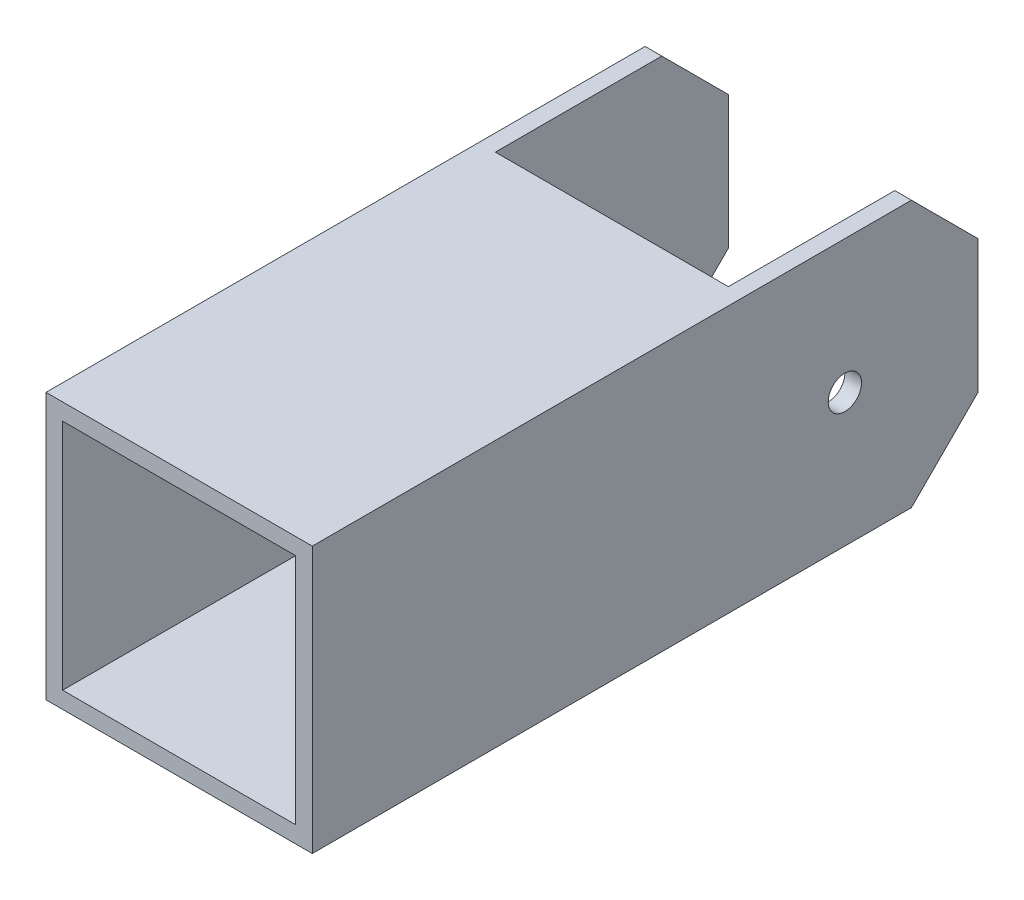
ISO-10303-21;
HEADER;
FILE_DESCRIPTION(('STEP AP214'),'2;1');
FILE_NAME('part.step','',(''),(''),'','','');
FILE_SCHEMA(('AUTOMOTIVE_DESIGN { 1 0 10303 214 1 1 1 1 }'));
ENDSEC;
DATA;
#1=APPLICATION_CONTEXT('core data for automotive mechanical design processes');
#2=APPLICATION_PROTOCOL_DEFINITION('international standard','automotive_design',2000,#1);
#3=PRODUCT_CONTEXT('',#1,'mechanical');
#4=PRODUCT('Part','Part','',(#3));
#5=PRODUCT_RELATED_PRODUCT_CATEGORY('part','',(#4));
#6=PRODUCT_DEFINITION_FORMATION('','',#4);
#7=PRODUCT_DEFINITION_CONTEXT('part definition',#1,'design');
#8=PRODUCT_DEFINITION('design','',#6,#7);
#9=PRODUCT_DEFINITION_SHAPE('','',#8);
#10=(LENGTH_UNIT() NAMED_UNIT(*) SI_UNIT(.MILLI.,.METRE.));
#11=(NAMED_UNIT(*) PLANE_ANGLE_UNIT() SI_UNIT($,.RADIAN.));
#12=(NAMED_UNIT(*) SI_UNIT($,.STERADIAN.) SOLID_ANGLE_UNIT());
#13=UNCERTAINTY_MEASURE_WITH_UNIT(LENGTH_MEASURE(1.E-05),#10,'distance_accuracy_value','');
#14=(GEOMETRIC_REPRESENTATION_CONTEXT(3) GLOBAL_UNCERTAINTY_ASSIGNED_CONTEXT((#13)) GLOBAL_UNIT_ASSIGNED_CONTEXT((#10,
#11,#12)) REPRESENTATION_CONTEXT('',''));
#15=CARTESIAN_POINT('',(0.,0.,0.));
#16=DIRECTION('',(0.,0.,1.));
#17=DIRECTION('',(1.,0.,0.));
#18=AXIS2_PLACEMENT_3D('',#15,#16,#17);
#19=CARTESIAN_POINT('',(0.,0.,0.));
#20=DIRECTION('',(0.,0.,1.));
#21=DIRECTION('',(1.,0.,0.));
#22=AXIS2_PLACEMENT_3D('',#19,#20,#21);
#23=PLANE('',#22);
#24=DIRECTION('',(0.,1.,0.));
#25=VECTOR('',#24,1.);
#26=CARTESIAN_POINT('',(22.225,22.225,0.));
#27=LINE('',#26,#25);
#28=CARTESIAN_POINT('',(22.225,-12.7,0.));
#29=VERTEX_POINT('',#28);
#30=CARTESIAN_POINT('',(22.225,12.7,0.));
#31=VERTEX_POINT('',#30);
#32=EDGE_CURVE('E197',#29,#31,#27,.T.);
#33=ORIENTED_EDGE('',*,*,#32,.T.);
#34=DIRECTION('',(1.,0.,0.));
#35=VECTOR('',#34,1.);
#36=CARTESIAN_POINT('',(0.,12.7,0.));
#37=LINE('',#36,#35);
#38=CARTESIAN_POINT('',(25.4,12.7,0.));
#39=VERTEX_POINT('',#38);
#40=EDGE_CURVE('E262',#31,#39,#37,.T.);
#41=ORIENTED_EDGE('',*,*,#40,.T.);
#42=DIRECTION('',(0.,1.,0.));
#43=VECTOR('',#42,1.);
#44=CARTESIAN_POINT('',(25.4,25.4,0.));
#45=LINE('',#44,#43);
#46=CARTESIAN_POINT('',(25.4,-12.7,0.));
#47=VERTEX_POINT('',#46);
#48=EDGE_CURVE('E220',#47,#39,#45,.T.);
#49=ORIENTED_EDGE('',*,*,#48,.F.);
#50=DIRECTION('',(-1.,0.,0.));
#51=VECTOR('',#50,1.);
#52=CARTESIAN_POINT('',(0.,-12.7,0.));
#53=LINE('',#52,#51);
#54=EDGE_CURVE('E260',#47,#29,#53,.T.);
#55=ORIENTED_EDGE('',*,*,#54,.T.);
#56=EDGE_LOOP('',(#33,#41,#49,#55));
#57=FACE_BOUND('',#56,.T.);
#58=ADVANCED_FACE('F35',(#57),#23,.F.);
#59=CARTESIAN_POINT('',(0.,0.,127.));
#60=DIRECTION('',(0.,0.,1.));
#61=DIRECTION('',(1.,0.,0.));
#62=AXIS2_PLACEMENT_3D('',#59,#60,#61);
#63=PLANE('',#62);
#64=DIRECTION('',(0.,1.,0.));
#65=VECTOR('',#64,1.);
#66=CARTESIAN_POINT('',(25.4,25.4,127.));
#67=LINE('',#66,#65);
#68=CARTESIAN_POINT('',(25.4,-25.4,127.));
#69=VERTEX_POINT('',#68);
#70=CARTESIAN_POINT('',(25.4,25.4,127.));
#71=VERTEX_POINT('',#70);
#72=EDGE_CURVE('E221',#69,#71,#67,.T.);
#73=ORIENTED_EDGE('',*,*,#72,.T.);
#74=DIRECTION('',(-1.,0.,0.));
#75=VECTOR('',#74,1.);
#76=CARTESIAN_POINT('',(-25.4,25.4,127.));
#77=LINE('',#76,#75);
#78=CARTESIAN_POINT('',(-25.4,25.4,127.));
#79=VERTEX_POINT('',#78);
#80=EDGE_CURVE('E224',#71,#79,#77,.T.);
#81=ORIENTED_EDGE('',*,*,#80,.T.);
#82=DIRECTION('',(0.,-1.,0.));
#83=VECTOR('',#82,1.);
#84=CARTESIAN_POINT('',(-25.4,25.4,127.));
#85=LINE('',#84,#83);
#86=CARTESIAN_POINT('',(-25.4,-25.4,127.));
#87=VERTEX_POINT('',#86);
#88=EDGE_CURVE('E227',#79,#87,#85,.T.);
#89=ORIENTED_EDGE('',*,*,#88,.T.);
#90=DIRECTION('',(1.,0.,0.));
#91=VECTOR('',#90,1.);
#92=CARTESIAN_POINT('',(-25.4,-25.4,127.));
#93=LINE('',#92,#91);
#94=EDGE_CURVE('E229',#87,#69,#93,.T.);
#95=ORIENTED_EDGE('',*,*,#94,.T.);
#96=EDGE_LOOP('',(#73,#81,#89,#95));
#97=FACE_BOUND('',#96,.T.);
#98=DIRECTION('',(-1.,0.,0.));
#99=VECTOR('',#98,1.);
#100=CARTESIAN_POINT('',(-22.225,22.225,127.));
#101=LINE('',#100,#99);
#102=CARTESIAN_POINT('',(22.225,22.225,127.));
#103=VERTEX_POINT('',#102);
#104=CARTESIAN_POINT('',(-22.225,22.225,127.));
#105=VERTEX_POINT('',#104);
#106=EDGE_CURVE('E200',#103,#105,#101,.T.);
#107=ORIENTED_EDGE('',*,*,#106,.F.);
#108=DIRECTION('',(0.,1.,0.));
#109=VECTOR('',#108,1.);
#110=CARTESIAN_POINT('',(22.225,22.225,127.));
#111=LINE('',#110,#109);
#112=CARTESIAN_POINT('',(22.225,-22.225,127.));
#113=VERTEX_POINT('',#112);
#114=EDGE_CURVE('E198',#113,#103,#111,.T.);
#115=ORIENTED_EDGE('',*,*,#114,.F.);
#116=DIRECTION('',(1.,0.,0.));
#117=VECTOR('',#116,1.);
#118=CARTESIAN_POINT('',(-22.225,-22.225,127.));
#119=LINE('',#118,#117);
#120=CARTESIAN_POINT('',(-22.225,-22.225,127.));
#121=VERTEX_POINT('',#120);
#122=EDGE_CURVE('E205',#121,#113,#119,.T.);
#123=ORIENTED_EDGE('',*,*,#122,.F.);
#124=DIRECTION('',(0.,-1.,0.));
#125=VECTOR('',#124,1.);
#126=CARTESIAN_POINT('',(-22.225,22.225,127.));
#127=LINE('',#126,#125);
#128=EDGE_CURVE('E203',#105,#121,#127,.T.);
#129=ORIENTED_EDGE('',*,*,#128,.F.);
#130=EDGE_LOOP('',(#107,#115,#123,#129));
#131=FACE_BOUND('',#130,.T.);
#132=ADVANCED_FACE('F290',(#97,#131),#63,.T.);
#133=DIRECTION('',(0.,-1.,0.));
#134=VECTOR('',#133,1.);
#135=CARTESIAN_POINT('',(-25.4,25.4,0.));
#136=LINE('',#135,#134);
#137=CARTESIAN_POINT('',(-25.4,12.7,0.));
#138=VERTEX_POINT('',#137);
#139=CARTESIAN_POINT('',(-25.4,-12.7,0.));
#140=VERTEX_POINT('',#139);
#141=EDGE_CURVE('E225',#138,#140,#136,.T.);
#142=ORIENTED_EDGE('',*,*,#141,.F.);
#143=DIRECTION('',(1.,0.,0.));
#144=VECTOR('',#143,1.);
#145=CARTESIAN_POINT('',(0.,12.7,0.));
#146=LINE('',#145,#144);
#147=CARTESIAN_POINT('',(-22.225,12.7,0.));
#148=VERTEX_POINT('',#147);
#149=EDGE_CURVE('E274',#138,#148,#146,.T.);
#150=ORIENTED_EDGE('',*,*,#149,.T.);
#151=DIRECTION('',(0.,-1.,0.));
#152=VECTOR('',#151,1.);
#153=CARTESIAN_POINT('',(-22.225,22.225,0.));
#154=LINE('',#153,#152);
#155=CARTESIAN_POINT('',(-22.225,-12.7,0.));
#156=VERTEX_POINT('',#155);
#157=EDGE_CURVE('E201',#148,#156,#154,.T.);
#158=ORIENTED_EDGE('',*,*,#157,.T.);
#159=DIRECTION('',(-1.,0.,0.));
#160=VECTOR('',#159,1.);
#161=CARTESIAN_POINT('',(0.,-12.7,0.));
#162=LINE('',#161,#160);
#163=EDGE_CURVE('E272',#156,#140,#162,.T.);
#164=ORIENTED_EDGE('',*,*,#163,.T.);
#165=EDGE_LOOP('',(#142,#150,#158,#164));
#166=FACE_BOUND('',#165,.T.);
#167=ADVANCED_FACE('F302',(#166),#23,.F.);
#168=CARTESIAN_POINT('',(25.4,25.4,127.));
#169=DIRECTION('',(-1.,0.,0.));
#170=DIRECTION('',(0.,-1.,0.));
#171=AXIS2_PLACEMENT_3D('',#168,#169,#170);
#172=PLANE('',#171);
#173=CARTESIAN_POINT('',(25.4,0.,25.4));
#174=DIRECTION('',(-1.,0.,0.));
#175=DIRECTION('',(0.,0.,1.));
#176=AXIS2_PLACEMENT_3D('',#173,#174,#175);
#177=CIRCLE('',#176,3.17499999999997);
#178=CARTESIAN_POINT('',(25.4,0.,28.5749999999999));
#179=VERTEX_POINT('',#178);
#180=EDGE_CURVE('E188',#179,#179,#177,.T.);
#181=ORIENTED_EDGE('',*,*,#180,.T.);
#182=EDGE_LOOP('',(#181));
#183=FACE_BOUND('',#182,.T.);
#184=ORIENTED_EDGE('',*,*,#48,.T.);
#185=DIRECTION('',(0.,-0.707106781186549,-0.707106781186546));
#186=VECTOR('',#185,1.);
#187=CARTESIAN_POINT('',(25.4,25.4,12.7));
#188=LINE('',#187,#186);
#189=CARTESIAN_POINT('',(25.4,25.4,12.7));
#190=VERTEX_POINT('',#189);
#191=EDGE_CURVE('E266',#39,#190,#188,.F.);
#192=ORIENTED_EDGE('',*,*,#191,.T.);
#193=DIRECTION('',(0.,0.,-1.));
#194=VECTOR('',#193,1.);
#195=CARTESIAN_POINT('',(25.4,25.4,127.));
#196=LINE('',#195,#194);
#197=EDGE_CURVE('E243',#71,#190,#196,.T.);
#198=ORIENTED_EDGE('',*,*,#197,.F.);
#199=ORIENTED_EDGE('',*,*,#72,.F.);
#200=DIRECTION('',(0.,0.,-1.));
#201=VECTOR('',#200,1.);
#202=CARTESIAN_POINT('',(25.4,-25.4,127.));
#203=LINE('',#202,#201);
#204=CARTESIAN_POINT('',(25.4,-25.4,12.7));
#205=VERTEX_POINT('',#204);
#206=EDGE_CURVE('E231',#69,#205,#203,.T.);
#207=ORIENTED_EDGE('',*,*,#206,.T.);
#208=DIRECTION('',(0.,-0.707106781186549,0.707106781186546));
#209=VECTOR('',#208,1.);
#210=CARTESIAN_POINT('',(25.4,-25.4,12.7));
#211=LINE('',#210,#209);
#212=EDGE_CURVE('E264',#205,#47,#211,.F.);
#213=ORIENTED_EDGE('',*,*,#212,.T.);
#214=EDGE_LOOP('',(#184,#192,#198,#199,#207,#213));
#215=FACE_BOUND('',#214,.T.);
#216=ADVANCED_FACE('F286',(#183,#215),#172,.F.);
#217=CARTESIAN_POINT('',(-25.4,25.4,127.));
#218=DIRECTION('',(0.,-1.,0.));
#219=DIRECTION('',(0.,0.,-1.));
#220=AXIS2_PLACEMENT_3D('',#217,#218,#219);
#221=PLANE('',#220);
#222=ORIENTED_EDGE('',*,*,#197,.T.);
#223=DIRECTION('',(-1.,0.,0.));
#224=VECTOR('',#223,1.);
#225=CARTESIAN_POINT('',(-25.4,25.4,12.7));
#226=LINE('',#225,#224);
#227=CARTESIAN_POINT('',(22.225,25.4,12.7));
#228=VERTEX_POINT('',#227);
#229=EDGE_CURVE('E253',#190,#228,#226,.T.);
#230=ORIENTED_EDGE('',*,*,#229,.T.);
#231=DIRECTION('',(0.,0.,-1.));
#232=VECTOR('',#231,1.);
#233=CARTESIAN_POINT('',(22.225,25.4,0.));
#234=LINE('',#233,#232);
#235=CARTESIAN_POINT('',(22.225,25.4,44.45));
#236=VERTEX_POINT('',#235);
#237=EDGE_CURVE('E175',#236,#228,#234,.T.);
#238=ORIENTED_EDGE('',*,*,#237,.F.);
#239=DIRECTION('',(1.,0.,0.));
#240=VECTOR('',#239,1.);
#241=CARTESIAN_POINT('',(22.225,25.4,44.45));
#242=LINE('',#241,#240);
#243=CARTESIAN_POINT('',(-22.225,25.4,44.45));
#244=VERTEX_POINT('',#243);
#245=EDGE_CURVE('E180',#244,#236,#242,.T.);
#246=ORIENTED_EDGE('',*,*,#245,.F.);
#247=DIRECTION('',(0.,0.,1.));
#248=VECTOR('',#247,1.);
#249=CARTESIAN_POINT('',(-22.225,25.4,0.));
#250=LINE('',#249,#248);
#251=CARTESIAN_POINT('',(-22.225,25.4,12.7));
#252=VERTEX_POINT('',#251);
#253=EDGE_CURVE('E178',#252,#244,#250,.T.);
#254=ORIENTED_EDGE('',*,*,#253,.F.);
#255=DIRECTION('',(-1.,0.,0.));
#256=VECTOR('',#255,1.);
#257=CARTESIAN_POINT('',(-25.4,25.4,12.7));
#258=LINE('',#257,#256);
#259=CARTESIAN_POINT('',(-25.4,25.4,12.7));
#260=VERTEX_POINT('',#259);
#261=EDGE_CURVE('E250',#252,#260,#258,.T.);
#262=ORIENTED_EDGE('',*,*,#261,.T.);
#263=DIRECTION('',(0.,0.,-1.));
#264=VECTOR('',#263,1.);
#265=CARTESIAN_POINT('',(-25.4,25.4,127.));
#266=LINE('',#265,#264);
#267=EDGE_CURVE('E240',#79,#260,#266,.T.);
#268=ORIENTED_EDGE('',*,*,#267,.F.);
#269=ORIENTED_EDGE('',*,*,#80,.F.);
#270=EDGE_LOOP('',(#222,#230,#238,#246,#254,#262,#268,#269));
#271=FACE_BOUND('',#270,.T.);
#272=ADVANCED_FACE('F310',(#271),#221,.F.);
#273=CARTESIAN_POINT('',(-25.4,25.4,127.));
#274=DIRECTION('',(1.,0.,0.));
#275=DIRECTION('',(0.,1.,0.));
#276=AXIS2_PLACEMENT_3D('',#273,#274,#275);
#277=PLANE('',#276);
#278=CARTESIAN_POINT('',(-25.4,0.,25.4));
#279=DIRECTION('',(-1.,0.,0.));
#280=DIRECTION('',(0.,0.,1.));
#281=AXIS2_PLACEMENT_3D('',#278,#279,#280);
#282=CIRCLE('',#281,3.17499999999997);
#283=CARTESIAN_POINT('',(-25.4,0.,28.5749999999999));
#284=VERTEX_POINT('',#283);
#285=EDGE_CURVE('E187',#284,#284,#282,.T.);
#286=ORIENTED_EDGE('',*,*,#285,.F.);
#287=EDGE_LOOP('',(#286));
#288=FACE_BOUND('',#287,.T.);
#289=ORIENTED_EDGE('',*,*,#267,.T.);
#290=DIRECTION('',(0.,0.707106781186549,0.707106781186546));
#291=VECTOR('',#290,1.);
#292=CARTESIAN_POINT('',(-25.4,25.4,12.7));
#293=LINE('',#292,#291);
#294=EDGE_CURVE('E270',#260,#138,#293,.F.);
#295=ORIENTED_EDGE('',*,*,#294,.T.);
#296=ORIENTED_EDGE('',*,*,#141,.T.);
#297=DIRECTION('',(0.,0.707106781186549,-0.707106781186546));
#298=VECTOR('',#297,1.);
#299=CARTESIAN_POINT('',(-25.4,-25.4,12.7));
#300=LINE('',#299,#298);
#301=CARTESIAN_POINT('',(-25.4,-25.4,12.7));
#302=VERTEX_POINT('',#301);
#303=EDGE_CURVE('E268',#140,#302,#300,.F.);
#304=ORIENTED_EDGE('',*,*,#303,.T.);
#305=DIRECTION('',(0.,0.,-1.));
#306=VECTOR('',#305,1.);
#307=CARTESIAN_POINT('',(-25.4,-25.4,127.));
#308=LINE('',#307,#306);
#309=EDGE_CURVE('E238',#87,#302,#308,.T.);
#310=ORIENTED_EDGE('',*,*,#309,.F.);
#311=ORIENTED_EDGE('',*,*,#88,.F.);
#312=EDGE_LOOP('',(#289,#295,#296,#304,#310,#311));
#313=FACE_BOUND('',#312,.T.);
#314=ADVANCED_FACE('F298',(#288,#313),#277,.F.);
#315=CARTESIAN_POINT('',(-25.4,-25.4,127.));
#316=DIRECTION('',(0.,1.,0.));
#317=DIRECTION('',(0.,0.,1.));
#318=AXIS2_PLACEMENT_3D('',#315,#316,#317);
#319=PLANE('',#318);
#320=ORIENTED_EDGE('',*,*,#309,.T.);
#321=DIRECTION('',(1.,0.,0.));
#322=VECTOR('',#321,1.);
#323=CARTESIAN_POINT('',(-25.4,-25.4,12.7));
#324=LINE('',#323,#322);
#325=CARTESIAN_POINT('',(-22.225,-25.4,12.7));
#326=VERTEX_POINT('',#325);
#327=EDGE_CURVE('E11',#302,#326,#324,.T.);
#328=ORIENTED_EDGE('',*,*,#327,.T.);
#329=DIRECTION('',(0.,0.,1.));
#330=VECTOR('',#329,1.);
#331=CARTESIAN_POINT('',(-22.225,-25.4,0.));
#332=LINE('',#331,#330);
#333=CARTESIAN_POINT('',(-22.225,-25.4,44.45));
#334=VERTEX_POINT('',#333);
#335=EDGE_CURVE('E147',#326,#334,#332,.T.);
#336=ORIENTED_EDGE('',*,*,#335,.T.);
#337=DIRECTION('',(1.,0.,0.));
#338=VECTOR('',#337,1.);
#339=CARTESIAN_POINT('',(22.225,-25.4,44.45));
#340=LINE('',#339,#338);
#341=CARTESIAN_POINT('',(22.225,-25.4,44.45));
#342=VERTEX_POINT('',#341);
#343=EDGE_CURVE('E153',#334,#342,#340,.T.);
#344=ORIENTED_EDGE('',*,*,#343,.T.);
#345=DIRECTION('',(0.,0.,-1.));
#346=VECTOR('',#345,1.);
#347=CARTESIAN_POINT('',(22.225,-25.4,0.));
#348=LINE('',#347,#346);
#349=CARTESIAN_POINT('',(22.225,-25.4,12.7));
#350=VERTEX_POINT('',#349);
#351=EDGE_CURVE('E154',#342,#350,#348,.T.);
#352=ORIENTED_EDGE('',*,*,#351,.T.);
#353=DIRECTION('',(1.,0.,0.));
#354=VECTOR('',#353,1.);
#355=CARTESIAN_POINT('',(-25.4,-25.4,12.7));
#356=LINE('',#355,#354);
#357=EDGE_CURVE('E43',#350,#205,#356,.T.);
#358=ORIENTED_EDGE('',*,*,#357,.T.);
#359=ORIENTED_EDGE('',*,*,#206,.F.);
#360=ORIENTED_EDGE('',*,*,#94,.F.);
#361=EDGE_LOOP('',(#320,#328,#336,#344,#352,#358,#359,#360));
#362=FACE_BOUND('',#361,.T.);
#363=ADVANCED_FACE('F150',(#362),#319,.F.);
#364=CARTESIAN_POINT('',(22.225,22.225,127.));
#365=DIRECTION('',(-1.,0.,0.));
#366=DIRECTION('',(0.,-1.,0.));
#367=AXIS2_PLACEMENT_3D('',#364,#365,#366);
#368=PLANE('',#367);
#369=ORIENTED_EDGE('',*,*,#237,.T.);
#370=DIRECTION('',(0.,0.707106781186549,0.707106781186546));
#371=VECTOR('',#370,1.);
#372=CARTESIAN_POINT('',(22.225,80.9625,68.2624999999998));
#373=LINE('',#372,#371);
#374=EDGE_CURVE('E258',#228,#31,#373,.F.);
#375=ORIENTED_EDGE('',*,*,#374,.T.);
#376=ORIENTED_EDGE('',*,*,#32,.F.);
#377=DIRECTION('',(0.,0.707106781186549,-0.707106781186546));
#378=VECTOR('',#377,1.);
#379=CARTESIAN_POINT('',(22.225,-58.7374999999999,46.0374999999998));
#380=LINE('',#379,#378);
#381=EDGE_CURVE('E256',#29,#350,#380,.F.);
#382=ORIENTED_EDGE('',*,*,#381,.T.);
#383=ORIENTED_EDGE('',*,*,#351,.F.);
#384=DIRECTION('',(0.,1.,0.));
#385=VECTOR('',#384,1.);
#386=CARTESIAN_POINT('',(22.225,-25.4,44.45));
#387=LINE('',#386,#385);
#388=CARTESIAN_POINT('',(22.225,-22.225,44.45));
#389=VERTEX_POINT('',#388);
#390=EDGE_CURVE('E169',#342,#389,#387,.T.);
#391=ORIENTED_EDGE('',*,*,#390,.T.);
#392=DIRECTION('',(0.,0.,-1.));
#393=VECTOR('',#392,1.);
#394=CARTESIAN_POINT('',(22.225,-22.225,127.));
#395=LINE('',#394,#393);
#396=EDGE_CURVE('E207',#113,#389,#395,.T.);
#397=ORIENTED_EDGE('',*,*,#396,.F.);
#398=ORIENTED_EDGE('',*,*,#114,.T.);
#399=DIRECTION('',(0.,0.,-1.));
#400=VECTOR('',#399,1.);
#401=CARTESIAN_POINT('',(22.225,22.225,127.));
#402=LINE('',#401,#400);
#403=CARTESIAN_POINT('',(22.225,22.225,44.45));
#404=VERTEX_POINT('',#403);
#405=EDGE_CURVE('E217',#103,#404,#402,.T.);
#406=ORIENTED_EDGE('',*,*,#405,.T.);
#407=EDGE_CURVE('E164',#404,#236,#387,.T.);
#408=ORIENTED_EDGE('',*,*,#407,.T.);
#409=EDGE_LOOP('',(#369,#375,#376,#382,#383,#391,#397,#398,#406,#408));
#410=FACE_BOUND('',#409,.T.);
#411=CARTESIAN_POINT('',(22.225,0.,25.4));
#412=DIRECTION('',(-1.,0.,0.));
#413=DIRECTION('',(0.,-1.,0.));
#414=AXIS2_PLACEMENT_3D('',#411,#412,#413);
#415=CIRCLE('',#414,3.17499999999997);
#416=CARTESIAN_POINT('',(22.225,-3.175,25.4));
#417=VERTEX_POINT('',#416);
#418=EDGE_CURVE('E194',#417,#417,#415,.T.);
#419=ORIENTED_EDGE('',*,*,#418,.F.);
#420=EDGE_LOOP('',(#419));
#421=FACE_BOUND('',#420,.T.);
#422=ADVANCED_FACE('F325',(#410,#421),#368,.T.);
#423=CARTESIAN_POINT('',(-22.225,22.225,127.));
#424=DIRECTION('',(0.,-1.,0.));
#425=DIRECTION('',(0.,0.,-1.));
#426=AXIS2_PLACEMENT_3D('',#423,#424,#425);
#427=PLANE('',#426);
#428=DIRECTION('',(-1.,0.,0.));
#429=VECTOR('',#428,1.);
#430=CARTESIAN_POINT('',(-22.225,22.225,44.45));
#431=LINE('',#430,#429);
#432=CARTESIAN_POINT('',(-22.225,22.225,44.45));
#433=VERTEX_POINT('',#432);
#434=EDGE_CURVE('E183',#404,#433,#431,.T.);
#435=ORIENTED_EDGE('',*,*,#434,.F.);
#436=ORIENTED_EDGE('',*,*,#405,.F.);
#437=ORIENTED_EDGE('',*,*,#106,.T.);
#438=DIRECTION('',(0.,0.,-1.));
#439=VECTOR('',#438,1.);
#440=CARTESIAN_POINT('',(-22.225,22.225,127.));
#441=LINE('',#440,#439);
#442=EDGE_CURVE('E214',#105,#433,#441,.T.);
#443=ORIENTED_EDGE('',*,*,#442,.T.);
#444=EDGE_LOOP('',(#435,#436,#437,#443));
#445=FACE_BOUND('',#444,.T.);
#446=ADVANCED_FACE('F336',(#445),#427,.T.);
#447=CARTESIAN_POINT('',(-22.225,22.225,127.));
#448=DIRECTION('',(1.,0.,0.));
#449=DIRECTION('',(0.,1.,0.));
#450=AXIS2_PLACEMENT_3D('',#447,#448,#449);
#451=PLANE('',#450);
#452=ORIENTED_EDGE('',*,*,#157,.F.);
#453=DIRECTION('',(0.,-0.707106781186549,-0.707106781186546));
#454=VECTOR('',#453,1.);
#455=CARTESIAN_POINT('',(-22.225,80.9625,68.2624999999998));
#456=LINE('',#455,#454);
#457=EDGE_CURVE('E277',#148,#252,#456,.F.);
#458=ORIENTED_EDGE('',*,*,#457,.T.);
#459=ORIENTED_EDGE('',*,*,#253,.T.);
#460=DIRECTION('',(0.,1.,0.));
#461=VECTOR('',#460,1.);
#462=CARTESIAN_POINT('',(-22.225,-25.4,44.45));
#463=LINE('',#462,#461);
#464=EDGE_CURVE('E165',#433,#244,#463,.T.);
#465=ORIENTED_EDGE('',*,*,#464,.F.);
#466=ORIENTED_EDGE('',*,*,#442,.F.);
#467=ORIENTED_EDGE('',*,*,#128,.T.);
#468=DIRECTION('',(0.,0.,-1.));
#469=VECTOR('',#468,1.);
#470=CARTESIAN_POINT('',(-22.225,-22.225,127.));
#471=LINE('',#470,#469);
#472=CARTESIAN_POINT('',(-22.225,-22.225,44.45));
#473=VERTEX_POINT('',#472);
#474=EDGE_CURVE('E161',#121,#473,#471,.T.);
#475=ORIENTED_EDGE('',*,*,#474,.T.);
#476=EDGE_CURVE('E157',#334,#473,#463,.T.);
#477=ORIENTED_EDGE('',*,*,#476,.F.);
#478=ORIENTED_EDGE('',*,*,#335,.F.);
#479=DIRECTION('',(0.,-0.707106781186549,0.707106781186546));
#480=VECTOR('',#479,1.);
#481=CARTESIAN_POINT('',(-22.225,-58.7374999999999,46.0374999999998));
#482=LINE('',#481,#480);
#483=EDGE_CURVE('E50',#326,#156,#482,.F.);
#484=ORIENTED_EDGE('',*,*,#483,.T.);
#485=EDGE_LOOP('',(#452,#458,#459,#465,#466,#467,#475,#477,#478,#484));
#486=FACE_BOUND('',#485,.T.);
#487=CARTESIAN_POINT('',(-22.225,0.,25.4));
#488=DIRECTION('',(1.,0.,0.));
#489=DIRECTION('',(0.,1.,0.));
#490=AXIS2_PLACEMENT_3D('',#487,#488,#489);
#491=CIRCLE('',#490,3.17499999999997);
#492=CARTESIAN_POINT('',(-22.225,3.17499999999993,25.4));
#493=VERTEX_POINT('',#492);
#494=EDGE_CURVE('E191',#493,#493,#491,.T.);
#495=ORIENTED_EDGE('',*,*,#494,.F.);
#496=EDGE_LOOP('',(#495));
#497=FACE_BOUND('',#496,.T.);
#498=ADVANCED_FACE('F158',(#486,#497),#451,.T.);
#499=CARTESIAN_POINT('',(-22.225,-22.225,127.));
#500=DIRECTION('',(0.,1.,0.));
#501=DIRECTION('',(0.,0.,1.));
#502=AXIS2_PLACEMENT_3D('',#499,#500,#501);
#503=PLANE('',#502);
#504=DIRECTION('',(1.,0.,0.));
#505=VECTOR('',#504,1.);
#506=CARTESIAN_POINT('',(-22.225,-22.225,44.45));
#507=LINE('',#506,#505);
#508=EDGE_CURVE('E246',#473,#389,#507,.T.);
#509=ORIENTED_EDGE('',*,*,#508,.F.);
#510=ORIENTED_EDGE('',*,*,#474,.F.);
#511=ORIENTED_EDGE('',*,*,#122,.T.);
#512=ORIENTED_EDGE('',*,*,#396,.T.);
#513=EDGE_LOOP('',(#509,#510,#511,#512));
#514=FACE_BOUND('',#513,.T.);
#515=ADVANCED_FACE('F323',(#514),#503,.T.);
#516=CARTESIAN_POINT('',(25.4,0.,25.4));
#517=DIRECTION('',(-1.,0.,0.));
#518=DIRECTION('',(0.,0.,1.));
#519=AXIS2_PLACEMENT_3D('',#516,#517,#518);
#520=CYLINDRICAL_SURFACE('',#519,3.17499999999997);
#521=ORIENTED_EDGE('',*,*,#494,.T.);
#522=EDGE_LOOP('',(#521));
#523=FACE_BOUND('',#522,.T.);
#524=ORIENTED_EDGE('',*,*,#285,.T.);
#525=EDGE_LOOP('',(#524));
#526=FACE_BOUND('',#525,.T.);
#527=ADVANCED_FACE('F473',(#523,#526),#520,.F.);
#528=ORIENTED_EDGE('',*,*,#418,.T.);
#529=EDGE_LOOP('',(#528));
#530=FACE_BOUND('',#529,.T.);
#531=ORIENTED_EDGE('',*,*,#180,.F.);
#532=EDGE_LOOP('',(#531));
#533=FACE_BOUND('',#532,.T.);
#534=ADVANCED_FACE('F440',(#530,#533),#520,.F.);
#535=CARTESIAN_POINT('',(22.225,-25.4,44.45));
#536=DIRECTION('',(0.,0.,1.));
#537=DIRECTION('',(1.,0.,0.));
#538=AXIS2_PLACEMENT_3D('',#535,#536,#537);
#539=PLANE('',#538);
#540=ORIENTED_EDGE('',*,*,#508,.T.);
#541=ORIENTED_EDGE('',*,*,#390,.F.);
#542=ORIENTED_EDGE('',*,*,#343,.F.);
#543=ORIENTED_EDGE('',*,*,#476,.T.);
#544=EDGE_LOOP('',(#540,#541,#542,#543));
#545=FACE_BOUND('',#544,.T.);
#546=ADVANCED_FACE('F167',(#545),#539,.F.);
#547=ORIENTED_EDGE('',*,*,#434,.T.);
#548=ORIENTED_EDGE('',*,*,#464,.T.);
#549=ORIENTED_EDGE('',*,*,#245,.T.);
#550=ORIENTED_EDGE('',*,*,#407,.F.);
#551=EDGE_LOOP('',(#547,#548,#549,#550));
#552=FACE_BOUND('',#551,.T.);
#553=ADVANCED_FACE('F313',(#552),#539,.F.);
#554=CARTESIAN_POINT('',(-25.4,25.4,12.7));
#555=DIRECTION('',(0.,-0.707106781186546,0.707106781186549));
#556=DIRECTION('',(-1.,0.,0.));
#557=AXIS2_PLACEMENT_3D('',#554,#555,#556);
#558=PLANE('',#557);
#559=ORIENTED_EDGE('',*,*,#191,.F.);
#560=ORIENTED_EDGE('',*,*,#40,.F.);
#561=ORIENTED_EDGE('',*,*,#374,.F.);
#562=ORIENTED_EDGE('',*,*,#229,.F.);
#563=EDGE_LOOP('',(#559,#560,#561,#562));
#564=FACE_BOUND('',#563,.T.);
#565=ADVANCED_FACE('F335',(#564),#558,.F.);
#566=CARTESIAN_POINT('',(-25.4,25.4,12.7));
#567=DIRECTION('',(0.,-0.707106781186546,0.707106781186549));
#568=DIRECTION('',(-1.,0.,0.));
#569=AXIS2_PLACEMENT_3D('',#566,#567,#568);
#570=PLANE('',#569);
#571=ORIENTED_EDGE('',*,*,#457,.F.);
#572=ORIENTED_EDGE('',*,*,#149,.F.);
#573=ORIENTED_EDGE('',*,*,#294,.F.);
#574=ORIENTED_EDGE('',*,*,#261,.F.);
#575=EDGE_LOOP('',(#571,#572,#573,#574));
#576=FACE_BOUND('',#575,.T.);
#577=ADVANCED_FACE('F305',(#576),#570,.F.);
#578=CARTESIAN_POINT('',(-25.4,-25.4,12.7));
#579=DIRECTION('',(0.,0.707106781186546,0.707106781186549));
#580=DIRECTION('',(1.,0.,0.));
#581=AXIS2_PLACEMENT_3D('',#578,#579,#580);
#582=PLANE('',#581);
#583=ORIENTED_EDGE('',*,*,#303,.F.);
#584=ORIENTED_EDGE('',*,*,#163,.F.);
#585=ORIENTED_EDGE('',*,*,#483,.F.);
#586=ORIENTED_EDGE('',*,*,#327,.F.);
#587=EDGE_LOOP('',(#583,#584,#585,#586));
#588=FACE_BOUND('',#587,.T.);
#589=ADVANCED_FACE('F297',(#588),#582,.F.);
#590=CARTESIAN_POINT('',(-25.4,-25.4,12.7));
#591=DIRECTION('',(0.,0.707106781186546,0.707106781186549));
#592=DIRECTION('',(1.,0.,0.));
#593=AXIS2_PLACEMENT_3D('',#590,#591,#592);
#594=PLANE('',#593);
#595=ORIENTED_EDGE('',*,*,#381,.F.);
#596=ORIENTED_EDGE('',*,*,#54,.F.);
#597=ORIENTED_EDGE('',*,*,#212,.F.);
#598=ORIENTED_EDGE('',*,*,#357,.F.);
#599=EDGE_LOOP('',(#595,#596,#597,#598));
#600=FACE_BOUND('',#599,.T.);
#601=ADVANCED_FACE('F37',(#600),#594,.F.);
#602=CLOSED_SHELL('',(#58,#132,#167,#216,#272,#314,#363,#422,#446,#498,#515,#527,#534,#546,#553,
#565,#577,#589,#601));
#603=MANIFOLD_SOLID_BREP('B2',#602);
#604=ADVANCED_BREP_SHAPE_REPRESENTATION('',(#18,#603),#14);
#605=SHAPE_DEFINITION_REPRESENTATION(#9,#604);
ENDSEC;
END-ISO-10303-21;
